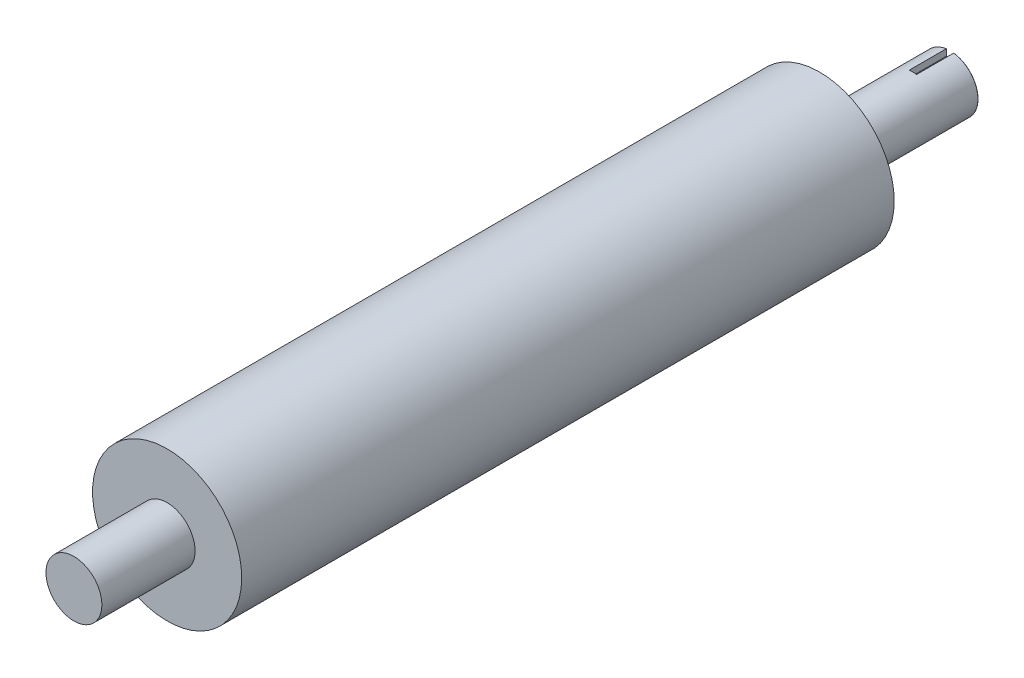
ISO-10303-21;
HEADER;
FILE_DESCRIPTION(('STEP AP214'),'2;1');
FILE_NAME('part.step','',(''),(''),'','','');
FILE_SCHEMA(('AUTOMOTIVE_DESIGN { 1 0 10303 214 1 1 1 1 }'));
ENDSEC;
DATA;
#1=APPLICATION_CONTEXT('core data for automotive mechanical design processes');
#2=APPLICATION_PROTOCOL_DEFINITION('international standard','automotive_design',2000,#1);
#3=PRODUCT_CONTEXT('',#1,'mechanical');
#4=PRODUCT('Part','Part','',(#3));
#5=PRODUCT_RELATED_PRODUCT_CATEGORY('part','',(#4));
#6=PRODUCT_DEFINITION_FORMATION('','',#4);
#7=PRODUCT_DEFINITION_CONTEXT('part definition',#1,'design');
#8=PRODUCT_DEFINITION('design','',#6,#7);
#9=PRODUCT_DEFINITION_SHAPE('','',#8);
#10=(LENGTH_UNIT() NAMED_UNIT(*) SI_UNIT(.MILLI.,.METRE.));
#11=(NAMED_UNIT(*) PLANE_ANGLE_UNIT() SI_UNIT($,.RADIAN.));
#12=(NAMED_UNIT(*) SI_UNIT($,.STERADIAN.) SOLID_ANGLE_UNIT());
#13=UNCERTAINTY_MEASURE_WITH_UNIT(LENGTH_MEASURE(1.E-05),#10,'distance_accuracy_value','');
#14=(GEOMETRIC_REPRESENTATION_CONTEXT(3) GLOBAL_UNCERTAINTY_ASSIGNED_CONTEXT((#13)) GLOBAL_UNIT_ASSIGNED_CONTEXT((#10,
#11,#12)) REPRESENTATION_CONTEXT('',''));
#15=CARTESIAN_POINT('',(0.,0.,0.));
#16=DIRECTION('',(0.,0.,1.));
#17=DIRECTION('',(1.,0.,0.));
#18=AXIS2_PLACEMENT_3D('',#15,#16,#17);
#19=CARTESIAN_POINT('',(0.,0.,0.));
#20=DIRECTION('',(0.,0.,1.));
#21=DIRECTION('',(1.,0.,0.));
#22=AXIS2_PLACEMENT_3D('',#19,#20,#21);
#23=PLANE('',#22);
#24=CARTESIAN_POINT('',(0.,0.,0.));
#25=DIRECTION('',(0.,0.,1.));
#26=DIRECTION('',(1.,0.,0.));
#27=AXIS2_PLACEMENT_3D('',#24,#25,#26);
#28=CIRCLE('',#27,40.);
#29=CARTESIAN_POINT('',(40.,0.,0.));
#30=VERTEX_POINT('',#29);
#31=EDGE_CURVE('E124',#30,#30,#28,.T.);
#32=ORIENTED_EDGE('',*,*,#31,.F.);
#33=EDGE_LOOP('',(#32));
#34=FACE_BOUND('',#33,.T.);
#35=CARTESIAN_POINT('',(0.,0.,0.));
#36=DIRECTION('',(0.,0.,1.));
#37=DIRECTION('',(1.,0.,0.));
#38=AXIS2_PLACEMENT_3D('',#35,#36,#37);
#39=CIRCLE('',#38,15.);
#40=CARTESIAN_POINT('',(15.,0.,0.));
#41=VERTEX_POINT('',#40);
#42=EDGE_CURVE('E130',#41,#41,#39,.F.);
#43=ORIENTED_EDGE('',*,*,#42,.F.);
#44=EDGE_LOOP('',(#43));
#45=FACE_BOUND('',#44,.T.);
#46=ADVANCED_FACE('F33',(#34,#45),#23,.F.);
#47=CARTESIAN_POINT('',(0.,0.,350.));
#48=DIRECTION('',(0.,0.,1.));
#49=DIRECTION('',(1.,0.,0.));
#50=AXIS2_PLACEMENT_3D('',#47,#48,#49);
#51=PLANE('',#50);
#52=CARTESIAN_POINT('',(0.,0.,350.));
#53=DIRECTION('',(0.,0.,1.));
#54=DIRECTION('',(1.,0.,0.));
#55=AXIS2_PLACEMENT_3D('',#52,#53,#54);
#56=CIRCLE('',#55,40.);
#57=CARTESIAN_POINT('',(40.,0.,350.));
#58=VERTEX_POINT('',#57);
#59=EDGE_CURVE('E127',#58,#58,#56,.T.);
#60=ORIENTED_EDGE('',*,*,#59,.T.);
#61=EDGE_LOOP('',(#60));
#62=FACE_BOUND('',#61,.T.);
#63=CARTESIAN_POINT('',(0.,0.,350.));
#64=DIRECTION('',(0.,0.,1.));
#65=DIRECTION('',(1.,0.,0.));
#66=AXIS2_PLACEMENT_3D('',#63,#64,#65);
#67=CIRCLE('',#66,15.);
#68=CARTESIAN_POINT('',(15.,0.,350.));
#69=VERTEX_POINT('',#68);
#70=EDGE_CURVE('E117',#69,#69,#67,.T.);
#71=ORIENTED_EDGE('',*,*,#70,.F.);
#72=EDGE_LOOP('',(#71));
#73=FACE_BOUND('',#72,.T.);
#74=ADVANCED_FACE('F166',(#62,#73),#51,.T.);
#75=CARTESIAN_POINT('',(0.,0.,350.));
#76=DIRECTION('',(0.,0.,-1.));
#77=DIRECTION('',(-1.,0.,0.));
#78=AXIS2_PLACEMENT_3D('',#75,#76,#77);
#79=CYLINDRICAL_SURFACE('',#78,40.);
#80=ORIENTED_EDGE('',*,*,#59,.F.);
#81=EDGE_LOOP('',(#80));
#82=FACE_BOUND('',#81,.T.);
#83=ORIENTED_EDGE('',*,*,#31,.T.);
#84=EDGE_LOOP('',(#83));
#85=FACE_BOUND('',#84,.T.);
#86=ADVANCED_FACE('F164',(#82,#85),#79,.T.);
#87=CARTESIAN_POINT('',(0.,0.,400.));
#88=DIRECTION('',(0.,0.,-1.));
#89=DIRECTION('',(-1.,0.,0.));
#90=AXIS2_PLACEMENT_3D('',#87,#88,#89);
#91=CYLINDRICAL_SURFACE('',#90,15.);
#92=CARTESIAN_POINT('',(0.,0.,400.));
#93=DIRECTION('',(0.,0.,1.));
#94=DIRECTION('',(1.,0.,0.));
#95=AXIS2_PLACEMENT_3D('',#92,#93,#94);
#96=CIRCLE('',#95,15.);
#97=CARTESIAN_POINT('',(15.,0.,400.));
#98=VERTEX_POINT('',#97);
#99=EDGE_CURVE('E121',#98,#98,#96,.T.);
#100=ORIENTED_EDGE('',*,*,#99,.F.);
#101=EDGE_LOOP('',(#100));
#102=FACE_BOUND('',#101,.T.);
#103=ORIENTED_EDGE('',*,*,#70,.T.);
#104=EDGE_LOOP('',(#103));
#105=FACE_BOUND('',#104,.T.);
#106=ADVANCED_FACE('F160',(#102,#105),#91,.T.);
#107=CARTESIAN_POINT('',(0.,0.,400.));
#108=DIRECTION('',(0.,0.,1.));
#109=DIRECTION('',(1.,0.,0.));
#110=AXIS2_PLACEMENT_3D('',#107,#108,#109);
#111=PLANE('',#110);
#112=ORIENTED_EDGE('',*,*,#99,.T.);
#113=EDGE_LOOP('',(#112));
#114=FACE_BOUND('',#113,.T.);
#115=ADVANCED_FACE('F157',(#114),#111,.T.);
#116=CARTESIAN_POINT('',(0.,0.,-70.));
#117=DIRECTION('',(0.,0.,1.));
#118=DIRECTION('',(1.,0.,0.));
#119=AXIS2_PLACEMENT_3D('',#116,#117,#118);
#120=CYLINDRICAL_SURFACE('',#119,15.);
#121=DIRECTION('',(0.,0.,-1.));
#122=VECTOR('',#121,1.);
#123=CARTESIAN_POINT('',(-1.99999999999999,14.8660687473185,-50.));
#124=LINE('',#123,#122);
#125=CARTESIAN_POINT('',(-1.99999999999999,14.8660687473185,-50.));
#126=VERTEX_POINT('',#125);
#127=CARTESIAN_POINT('',(-1.99999999999999,14.8660687473185,-69.9));
#128=VERTEX_POINT('',#127);
#129=EDGE_CURVE('E94',#126,#128,#124,.T.);
#130=ORIENTED_EDGE('',*,*,#129,.T.);
#131=CARTESIAN_POINT('',(0.,0.,-69.9));
#132=DIRECTION('',(0.,0.,-1.));
#133=DIRECTION('',(-1.,0.,0.));
#134=AXIS2_PLACEMENT_3D('',#131,#132,#133);
#135=CIRCLE('',#134,15.);
#136=CARTESIAN_POINT('',(2.,14.8660687473185,-69.9));
#137=VERTEX_POINT('',#136);
#138=EDGE_CURVE('E46',#128,#137,#135,.F.);
#139=ORIENTED_EDGE('',*,*,#138,.T.);
#140=DIRECTION('',(0.,0.,-1.));
#141=VECTOR('',#140,1.);
#142=CARTESIAN_POINT('',(2.,14.8660687473185,-50.));
#143=LINE('',#142,#141);
#144=CARTESIAN_POINT('',(2.,14.8660687473185,-50.));
#145=VERTEX_POINT('',#144);
#146=EDGE_CURVE('E118',#145,#137,#143,.T.);
#147=ORIENTED_EDGE('',*,*,#146,.F.);
#148=CARTESIAN_POINT('',(0.,0.,-50.));
#149=DIRECTION('',(0.,0.,-1.));
#150=DIRECTION('',(-1.,0.,0.));
#151=AXIS2_PLACEMENT_3D('',#148,#149,#150);
#152=CIRCLE('',#151,15.);
#153=EDGE_CURVE('E102',#126,#145,#152,.T.);
#154=ORIENTED_EDGE('',*,*,#153,.F.);
#155=EDGE_LOOP('',(#130,#139,#147,#154));
#156=FACE_BOUND('',#155,.T.);
#157=ORIENTED_EDGE('',*,*,#42,.T.);
#158=EDGE_LOOP('',(#157));
#159=FACE_BOUND('',#158,.T.);
#160=ADVANCED_FACE('F153',(#156,#159),#120,.T.);
#161=CARTESIAN_POINT('',(0.,0.,-70.));
#162=DIRECTION('',(0.,0.,-1.));
#163=DIRECTION('',(-1.,0.,0.));
#164=AXIS2_PLACEMENT_3D('',#161,#162,#163);
#165=PLANE('',#164);
#166=DIRECTION('',(0.,-1.,0.));
#167=VECTOR('',#166,1.);
#168=CARTESIAN_POINT('',(2.,11.3247516529061,-70.));
#169=LINE('',#168,#167);
#170=CARTESIAN_POINT('',(2.,14.7651616990807,-70.));
#171=VERTEX_POINT('',#170);
#172=CARTESIAN_POINT('',(2.,11.3247516529061,-70.));
#173=VERTEX_POINT('',#172);
#174=EDGE_CURVE('E106',#171,#173,#169,.T.);
#175=ORIENTED_EDGE('',*,*,#174,.F.);
#176=CARTESIAN_POINT('',(0.,0.,-70.));
#177=DIRECTION('',(0.,0.,-1.));
#178=DIRECTION('',(-1.,0.,0.));
#179=AXIS2_PLACEMENT_3D('',#176,#177,#178);
#180=CIRCLE('',#179,14.9);
#181=CARTESIAN_POINT('',(-1.99999999999999,14.7651616990807,-70.));
#182=VERTEX_POINT('',#181);
#183=EDGE_CURVE('E135',#171,#182,#180,.T.);
#184=ORIENTED_EDGE('',*,*,#183,.T.);
#185=DIRECTION('',(0.,1.,0.));
#186=VECTOR('',#185,1.);
#187=CARTESIAN_POINT('',(-2.,11.3247516529061,-70.));
#188=LINE('',#187,#186);
#189=CARTESIAN_POINT('',(-2.,11.3247516529061,-70.));
#190=VERTEX_POINT('',#189);
#191=EDGE_CURVE('E108',#190,#182,#188,.T.);
#192=ORIENTED_EDGE('',*,*,#191,.F.);
#193=CARTESIAN_POINT('',(0.,0.,-70.));
#194=DIRECTION('',(0.,0.,1.));
#195=DIRECTION('',(-1.,0.,0.));
#196=AXIS2_PLACEMENT_3D('',#193,#194,#195);
#197=CIRCLE('',#196,11.5);
#198=EDGE_CURVE('E92',#173,#190,#197,.T.);
#199=ORIENTED_EDGE('',*,*,#198,.F.);
#200=EDGE_LOOP('',(#175,#184,#192,#199));
#201=FACE_BOUND('',#200,.T.);
#202=ADVANCED_FACE('F150',(#201),#165,.T.);
#203=CARTESIAN_POINT('',(0.,0.,-50.));
#204=DIRECTION('',(0.,0.,-1.));
#205=DIRECTION('',(-1.,0.,0.));
#206=AXIS2_PLACEMENT_3D('',#203,#204,#205);
#207=CYLINDRICAL_SURFACE('',#206,11.5);
#208=ORIENTED_EDGE('',*,*,#198,.T.);
#209=DIRECTION('',(0.,0.,-1.));
#210=VECTOR('',#209,1.);
#211=CARTESIAN_POINT('',(-2.,11.3247516529061,-50.));
#212=LINE('',#211,#210);
#213=CARTESIAN_POINT('',(-2.,11.3247516529061,-50.));
#214=VERTEX_POINT('',#213);
#215=EDGE_CURVE('E84',#214,#190,#212,.T.);
#216=ORIENTED_EDGE('',*,*,#215,.F.);
#217=CARTESIAN_POINT('',(0.,0.,-50.));
#218=DIRECTION('',(0.,0.,1.));
#219=DIRECTION('',(-1.,0.,0.));
#220=AXIS2_PLACEMENT_3D('',#217,#218,#219);
#221=CIRCLE('',#220,11.5);
#222=CARTESIAN_POINT('',(2.,11.3247516529061,-50.));
#223=VERTEX_POINT('',#222);
#224=EDGE_CURVE('E89',#223,#214,#221,.T.);
#225=ORIENTED_EDGE('',*,*,#224,.F.);
#226=DIRECTION('',(0.,0.,-1.));
#227=VECTOR('',#226,1.);
#228=CARTESIAN_POINT('',(2.,11.3247516529061,-50.));
#229=LINE('',#228,#227);
#230=EDGE_CURVE('E115',#223,#173,#229,.T.);
#231=ORIENTED_EDGE('',*,*,#230,.T.);
#232=EDGE_LOOP('',(#208,#216,#225,#231));
#233=FACE_BOUND('',#232,.T.);
#234=ADVANCED_FACE('F86',(#233),#207,.T.);
#235=CARTESIAN_POINT('',(2.,11.3247516529061,-50.));
#236=DIRECTION('',(1.,0.,0.));
#237=DIRECTION('',(0.,0.,-1.));
#238=AXIS2_PLACEMENT_3D('',#235,#236,#237);
#239=PLANE('',#238);
#240=ORIENTED_EDGE('',*,*,#146,.T.);
#241=CARTESIAN_POINT('',(2.,14.8660687473185,-69.9));
#242=CARTESIAN_POINT('',(2.,14.8660737339756,-69.9055893940991));
#243=CARTESIAN_POINT('',(2.,14.8655962126088,-69.9111770641109));
#244=CARTESIAN_POINT('',(2.,14.8637133052753,-69.9221881118159));
#245=CARTESIAN_POINT('',(2.,14.8623088828435,-69.9276116540071));
#246=CARTESIAN_POINT('',(2.,14.8586084562205,-69.9381479201644));
#247=CARTESIAN_POINT('',(2.,14.8563121014182,-69.9432605209869));
#248=CARTESIAN_POINT('',(2.,14.8508975287006,-69.9530291461228));
#249=CARTESIAN_POINT('',(2.,14.8477793971289,-69.957685218333));
#250=CARTESIAN_POINT('',(2.,14.8407978139584,-69.966430037707));
#251=CARTESIAN_POINT('',(2.,14.8369315028335,-69.9705165013128));
#252=CARTESIAN_POINT('',(2.,14.8285720441192,-69.9779897089868));
#253=CARTESIAN_POINT('',(2.,14.8240787646586,-69.9813763054782));
#254=CARTESIAN_POINT('',(2.,14.8145526654395,-69.9873837827949));
#255=CARTESIAN_POINT('',(2.,14.8095155247299,-69.9899978044056));
#256=CARTESIAN_POINT('',(2.,14.7990771234422,-69.9943497281688));
#257=CARTESIAN_POINT('',(2.,14.7936760308582,-69.9960880314399));
#258=CARTESIAN_POINT('',(2.,14.7843996143283,-69.9982411501415));
#259=CARTESIAN_POINT('',(2.,14.7805791436761,-69.9989003258458));
#260=CARTESIAN_POINT('',(2.,14.7728935061676,-69.9997797181654));
#261=CARTESIAN_POINT('',(2.,14.7690284102904,-70.0000005552528));
#262=CARTESIAN_POINT('',(2.,14.7651616990809,-70.0000000000007));
#263=B_SPLINE_CURVE_WITH_KNOTS('',3,(#241,#242,#243,#244,#245,#246,#247,#248,#249,#250,#251,
#252,#253,#254,#255,#256,#257,#258,#259,#260,#261,#262),.UNSPECIFIED.,.F.,.F.,(4,2,2,2,2,2,2,2,
2,2,4),(0.,0.0167452939924825,0.0334732082301842,0.0502077047375611,0.0669404436631937,
0.0837384450213137,0.100539984866655,0.117486498864843,0.134425243518642,0.146032374636114,
0.157623064007853),.UNSPECIFIED.);
#264=EDGE_CURVE('E11',#137,#171,#263,.T.);
#265=ORIENTED_EDGE('',*,*,#264,.T.);
#266=ORIENTED_EDGE('',*,*,#174,.T.);
#267=ORIENTED_EDGE('',*,*,#230,.F.);
#268=DIRECTION('',(0.,-1.,0.));
#269=VECTOR('',#268,1.);
#270=CARTESIAN_POINT('',(2.,11.3247516529061,-50.));
#271=LINE('',#270,#269);
#272=EDGE_CURVE('E95',#145,#223,#271,.T.);
#273=ORIENTED_EDGE('',*,*,#272,.F.);
#274=EDGE_LOOP('',(#240,#265,#266,#267,#273));
#275=FACE_BOUND('',#274,.T.);
#276=ADVANCED_FACE('F145',(#275),#239,.F.);
#277=CARTESIAN_POINT('',(-2.,11.3247516529061,-50.));
#278=DIRECTION('',(-1.,0.,0.));
#279=DIRECTION('',(0.,-1.,0.));
#280=AXIS2_PLACEMENT_3D('',#277,#278,#279);
#281=PLANE('',#280);
#282=ORIENTED_EDGE('',*,*,#191,.T.);
#283=CARTESIAN_POINT('',(-1.99999999999999,14.7651616990807,-70.));
#284=CARTESIAN_POINT('',(-1.99999999999999,14.7708762952702,-70.0000046055022));
#285=CARTESIAN_POINT('',(-1.99999999999999,14.7765897705894,-69.9995192424315));
#286=CARTESIAN_POINT('',(-1.99999999999999,14.7878527947179,-69.9976021239313));
#287=CARTESIAN_POINT('',(-1.99999999999999,14.793402426847,-69.9961708584977));
#288=CARTESIAN_POINT('',(-1.99999999999999,14.8041854095304,-69.9923943356298));
#289=CARTESIAN_POINT('',(-1.99999999999999,14.8094185772248,-69.9900485554897));
#290=CARTESIAN_POINT('',(-1.99999999999999,14.8194134173377,-69.9845089523363));
#291=CARTESIAN_POINT('',(-1.99999999999999,14.8241752078709,-69.9813153425091));
#292=CARTESIAN_POINT('',(-1.99999999999999,14.8330707946888,-69.9741828200531));
#293=CARTESIAN_POINT('',(-1.99999999999999,14.8372071317521,-69.9702470772286));
#294=CARTESIAN_POINT('',(-1.99999999999999,14.8447542722396,-69.9617306699449));
#295=CARTESIAN_POINT('',(-1.99999999999999,14.8481649468472,-69.957149891221));
#296=CARTESIAN_POINT('',(-1.99999999999999,14.8541320237535,-69.947515860672));
#297=CARTESIAN_POINT('',(-1.99999999999999,14.8566953368054,-69.9424668839729));
#298=CARTESIAN_POINT('',(-1.99999999999999,14.8609285932015,-69.9320090769682));
#299=CARTESIAN_POINT('',(-1.99999999999999,14.8625991747956,-69.9266005068697));
#300=CARTESIAN_POINT('',(-1.99999999999999,14.8645530948512,-69.9176284557692));
#301=CARTESIAN_POINT('',(-1.99999999999999,14.865121128683,-69.9141244293543));
#302=CARTESIAN_POINT('',(-1.99999999999999,14.8658788785843,-69.9070807911157));
#303=CARTESIAN_POINT('',(-1.99999999999999,14.8660691346549,-69.9035412373648));
#304=CARTESIAN_POINT('',(-1.99999999999999,14.8660687473188,-69.9000000000001));
#305=B_SPLINE_CURVE_WITH_KNOTS('',3,(#283,#284,#285,#286,#287,#288,#289,#290,#291,#292,#293,
#294,#295,#296,#297,#298,#299,#300,#301,#302,#303,#304),.UNSPECIFIED.,.F.,.F.,(4,2,2,2,2,2,2,2,
2,2,4),(0.,0.0171216670271943,0.0342344716401473,0.0513570717312969,0.0684753704292877,
0.0855221448274868,0.102571942779852,0.11947904600311,0.136374045424006,0.14700457374373,
0.157619895658319),.UNSPECIFIED.);
#306=EDGE_CURVE('E60',#182,#128,#305,.T.);
#307=ORIENTED_EDGE('',*,*,#306,.T.);
#308=ORIENTED_EDGE('',*,*,#129,.F.);
#309=DIRECTION('',(0.,1.,0.));
#310=VECTOR('',#309,1.);
#311=CARTESIAN_POINT('',(-2.,11.3247516529061,-50.));
#312=LINE('',#311,#310);
#313=EDGE_CURVE('E98',#214,#126,#312,.T.);
#314=ORIENTED_EDGE('',*,*,#313,.F.);
#315=ORIENTED_EDGE('',*,*,#215,.T.);
#316=EDGE_LOOP('',(#282,#307,#308,#314,#315));
#317=FACE_BOUND('',#316,.T.);
#318=ADVANCED_FACE('F99',(#317),#281,.F.);
#319=CARTESIAN_POINT('',(0.,0.,-50.));
#320=DIRECTION('',(0.,0.,-1.));
#321=DIRECTION('',(-1.,0.,0.));
#322=AXIS2_PLACEMENT_3D('',#319,#320,#321);
#323=PLANE('',#322);
#324=ORIENTED_EDGE('',*,*,#224,.T.);
#325=ORIENTED_EDGE('',*,*,#313,.T.);
#326=ORIENTED_EDGE('',*,*,#153,.T.);
#327=ORIENTED_EDGE('',*,*,#272,.T.);
#328=EDGE_LOOP('',(#324,#325,#326,#327));
#329=FACE_BOUND('',#328,.T.);
#330=ADVANCED_FACE('F104',(#329),#323,.T.);
#331=CARTESIAN_POINT('',(0.,0.,-69.9));
#332=DIRECTION('',(0.,0.,-1.));
#333=DIRECTION('',(-1.,0.,0.));
#334=AXIS2_PLACEMENT_3D('',#331,#332,#333);
#335=TOROIDAL_SURFACE('',#334,14.9,0.1);
#336=ORIENTED_EDGE('',*,*,#264,.F.);
#337=ORIENTED_EDGE('',*,*,#138,.F.);
#338=ORIENTED_EDGE('',*,*,#306,.F.);
#339=ORIENTED_EDGE('',*,*,#183,.F.);
#340=EDGE_LOOP('',(#336,#337,#338,#339));
#341=FACE_BOUND('',#340,.T.);
#342=ADVANCED_FACE('F35',(#341),#335,.T.);
#343=CLOSED_SHELL('',(#46,#74,#86,#106,#115,#160,#202,#234,#276,#318,#330,#342));
#344=MANIFOLD_SOLID_BREP('B2',#343);
#345=ADVANCED_BREP_SHAPE_REPRESENTATION('',(#18,#344),#14);
#346=SHAPE_DEFINITION_REPRESENTATION(#9,#345);
ENDSEC;
END-ISO-10303-21;
